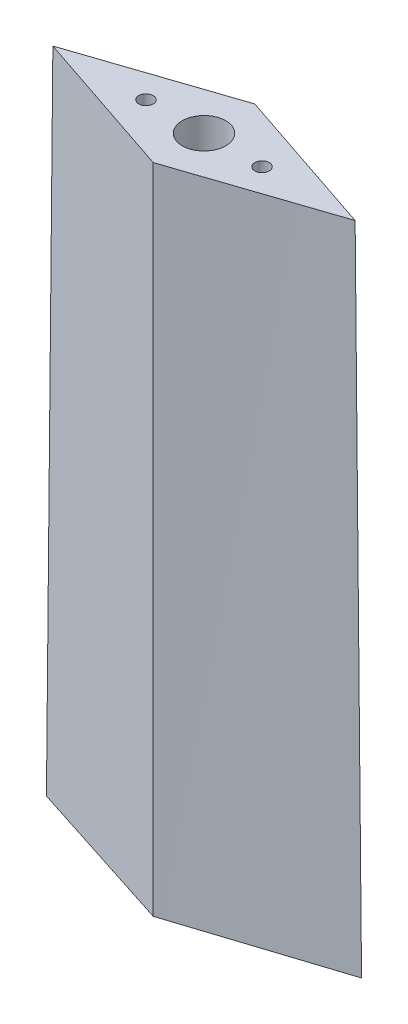
ISO-10303-21;
HEADER;
FILE_DESCRIPTION(('STEP AP214'),'2;1');
FILE_NAME('part.step','',(''),(''),'','','');
FILE_SCHEMA(('AUTOMOTIVE_DESIGN { 1 0 10303 214 1 1 1 1 }'));
ENDSEC;
DATA;
#1=APPLICATION_CONTEXT('core data for automotive mechanical design processes');
#2=APPLICATION_PROTOCOL_DEFINITION('international standard','automotive_design',2000,#1);
#3=PRODUCT_CONTEXT('',#1,'mechanical');
#4=PRODUCT('Part','Part','',(#3));
#5=PRODUCT_RELATED_PRODUCT_CATEGORY('part','',(#4));
#6=PRODUCT_DEFINITION_FORMATION('','',#4);
#7=PRODUCT_DEFINITION_CONTEXT('part definition',#1,'design');
#8=PRODUCT_DEFINITION('design','',#6,#7);
#9=PRODUCT_DEFINITION_SHAPE('','',#8);
#10=(LENGTH_UNIT() NAMED_UNIT(*) SI_UNIT(.MILLI.,.METRE.));
#11=(NAMED_UNIT(*) PLANE_ANGLE_UNIT() SI_UNIT($,.RADIAN.));
#12=(NAMED_UNIT(*) SI_UNIT($,.STERADIAN.) SOLID_ANGLE_UNIT());
#13=UNCERTAINTY_MEASURE_WITH_UNIT(LENGTH_MEASURE(1.E-05),#10,'distance_accuracy_value','');
#14=(GEOMETRIC_REPRESENTATION_CONTEXT(3) GLOBAL_UNCERTAINTY_ASSIGNED_CONTEXT((#13)) GLOBAL_UNIT_ASSIGNED_CONTEXT((#10,
#11,#12)) REPRESENTATION_CONTEXT('',''));
#15=CARTESIAN_POINT('',(0.,0.,0.));
#16=DIRECTION('',(0.,0.,1.));
#17=DIRECTION('',(1.,0.,0.));
#18=AXIS2_PLACEMENT_3D('',#15,#16,#17);
#19=CARTESIAN_POINT('',(219.716026671538,465.168027231046,0.));
#20=CARTESIAN_POINT('',(213.502471629307,1096.96763455169,0.));
#21=CARTESIAN_POINT('',(213.274793673085,465.168027231046,1.85208333333331));
#22=CARTESIAN_POINT('',(208.096831137892,1096.96763455169,1.85208333333331));
#23=CARTESIAN_POINT('',(206.833560674631,465.168027231046,3.70416666666664));
#24=CARTESIAN_POINT('',(202.691190646477,1096.96763455169,3.70416666666663));
#25=CARTESIAN_POINT('',(193.951094677724,465.168027231046,7.4083333333333));
#26=CARTESIAN_POINT('',(191.879909663647,1096.96763455169,7.4083333333333));
#27=CARTESIAN_POINT('',(187.509861679271,465.168027231046,9.26041666666665));
#28=CARTESIAN_POINT('',(186.474269172232,1096.96763455169,9.26041666666665));
#29=CARTESIAN_POINT('',(181.068628680817,465.168027231046,11.1125));
#30=CARTESIAN_POINT('',(181.068628680817,1096.96763455169,11.1125));
#31=B_SPLINE_SURFACE_WITH_KNOTS('',3,1,((#19,#20),(#21,#22),(#23,#24),(#25,#26),(#27,#28),(#29,
#30)),.UNSPECIFIED.,.F.,.F.,.F.,(4,2,4),(2,2),(0.,0.5,1.),(0.,1.),.UNSPECIFIED.);
#32=CARTESIAN_POINT('',(215.551829032432,888.587215652406,0.));
#33=CARTESIAN_POINT('',(212.362250617464,888.587215652406,1.02786834675771));
#34=CARTESIAN_POINT('',(209.172672202496,888.587215652406,2.05573669351542));
#35=CARTESIAN_POINT('',(202.793515372561,888.587215652406,4.11147338703085));
#36=CARTESIAN_POINT('',(199.603936957593,888.587215652406,5.13934173378856));
#37=CARTESIAN_POINT('',(191.299115255356,888.587215652406,7.81564005369751));
#38=CARTESIAN_POINT('',(186.183871968087,888.587215652406,9.46407002684876));
#39=CARTESIAN_POINT('',(181.068628680817,888.587215652406,11.1125));
#40=B_SPLINE_CURVE_WITH_KNOTS('',3,(#32,#33,#34,#35,#36,#37,#38,#39),.UNSPECIFIED.,.F.,.F.,(4,2,
2,4),(0.,10.0533235415682,20.1066470831363,36.2295288782446),.UNSPECIFIED.);
#41=CARTESIAN_POINT('',(215.551829032432,888.587215652406,0.));
#42=VERTEX_POINT('',#41);
#43=CARTESIAN_POINT('',(181.068628680817,888.587215652406,11.1125));
#44=VERTEX_POINT('',#43);
#45=EDGE_CURVE('E142',#42,#44,#40,.T.);
#46=DIRECTION('',(-0.00983421721197636,0.99995164291671,0.));
#47=VECTOR('',#46,1.);
#48=CARTESIAN_POINT('',(219.716026671538,465.168027231046,0.));
#49=LINE('',#48,#47);
#50=CARTESIAN_POINT('',(214.146697300198,1031.46221565241,0.));
#51=VERTEX_POINT('',#50);
#52=EDGE_CURVE('E12',#42,#51,#49,.T.);
#53=CARTESIAN_POINT('',(181.068628680817,1031.46221565241,11.1125));
#54=CARTESIAN_POINT('',(184.245268499691,1031.46221565241,10.0453152621779));
#55=CARTESIAN_POINT('',(187.421908318565,1031.46221565241,8.97813052435588));
#56=CARTESIAN_POINT('',(193.775187956312,1031.46221565241,6.84376104871176));
#57=CARTESIAN_POINT('',(196.951827775186,1031.46221565241,5.7765763108897));
#58=CARTESIAN_POINT('',(204.801210829439,1031.46221565241,3.13959438204509));
#59=CARTESIAN_POINT('',(209.473954064819,1031.46221565241,1.56979719102255));
#60=CARTESIAN_POINT('',(214.146697300198,1031.46221565241,0.));
#61=B_SPLINE_CURVE_WITH_KNOTS('',3,(#53,#54,#55,#56,#57,#58,#59,#60),.UNSPECIFIED.,.F.,.F.,(4,2,
2,4),(0.,10.0533235415682,20.1066470831363,34.8947887203586),.UNSPECIFIED.);
#62=CARTESIAN_POINT('',(181.068628680817,1031.46221565241,11.1125));
#63=VERTEX_POINT('',#62);
#64=EDGE_CURVE('E120',#63,#51,#61,.T.);
#65=DIRECTION('',(0.,1.,0.));
#66=VECTOR('',#65,1.);
#67=CARTESIAN_POINT('',(181.068628680817,781.067830891368,11.1125));
#68=LINE('',#67,#66);
#69=EDGE_CURVE('E68',#44,#63,#68,.T.);
#70=ORIENTED_EDGE('',*,*,#45,.F.);
#71=ORIENTED_EDGE('',*,*,#52,.T.);
#72=ORIENTED_EDGE('',*,*,#64,.F.);
#73=ORIENTED_EDGE('',*,*,#69,.F.);
#74=EDGE_LOOP('',(#70,#71,#72,#73));
#75=FACE_BOUND('',#74,.T.);
#76=ADVANCED_FACE('F61',(#75),#31,.F.);
#77=CARTESIAN_POINT('',(181.068628680817,465.168027231046,11.1125));
#78=CARTESIAN_POINT('',(181.068628680817,1096.96763455169,11.1125));
#79=CARTESIAN_POINT('',(174.627395682364,465.168027231046,9.26041666666668));
#80=CARTESIAN_POINT('',(175.662988189402,1096.96763455169,9.26041666666663));
#81=CARTESIAN_POINT('',(168.186162683911,465.168027231046,7.40833333333335));
#82=CARTESIAN_POINT('',(170.257347697988,1096.96763455169,7.40833333333328));
#83=CARTESIAN_POINT('',(155.303696687004,465.168027231046,3.70416666666668));
#84=CARTESIAN_POINT('',(159.446066715158,1096.96763455169,3.70416666666661));
#85=CARTESIAN_POINT('',(148.86246368855,465.168027231046,1.85208333333334));
#86=CARTESIAN_POINT('',(154.040426223743,1096.96763455169,1.8520833333333));
#87=CARTESIAN_POINT('',(142.421230690097,465.168027231046,0.));
#88=CARTESIAN_POINT('',(148.634785732328,1096.96763455169,0.));
#89=B_SPLINE_SURFACE_WITH_KNOTS('',3,1,((#77,#78),(#79,#80),(#81,#82),(#83,#84),(#85,#86),(#87,
#88)),.UNSPECIFIED.,.F.,.F.,.F.,(4,2,4),(2,2),(0.,0.5,1.),(0.,1.),.UNSPECIFIED.);
#90=CARTESIAN_POINT('',(181.068628680817,888.587215652406,11.1125));
#91=CARTESIAN_POINT('',(177.87905026585,888.587215652406,10.0846316532423));
#92=CARTESIAN_POINT('',(174.689471850882,888.587215652406,9.05676330648458));
#93=CARTESIAN_POINT('',(168.310315020947,888.587215652406,7.00102661296915));
#94=CARTESIAN_POINT('',(165.120736605979,888.587215652406,5.97315826621144));
#95=CARTESIAN_POINT('',(156.815914903742,888.587215652406,3.29685994630247));
#96=CARTESIAN_POINT('',(151.700671616473,888.587215652406,1.64842997315123));
#97=CARTESIAN_POINT('',(146.585428329203,888.587215652406,0.));
#98=B_SPLINE_CURVE_WITH_KNOTS('',3,(#90,#91,#92,#93,#94,#95,#96,#97),.UNSPECIFIED.,.F.,.F.,(4,2,
2,4),(0.,10.0533235415682,20.1066470831363,36.2295288782446),.UNSPECIFIED.);
#99=CARTESIAN_POINT('',(146.585428329203,888.587215652406,0.));
#100=VERTEX_POINT('',#99);
#101=EDGE_CURVE('E80',#44,#100,#98,.T.);
#102=CARTESIAN_POINT('',(147.990560061437,1031.46221565241,0.));
#103=CARTESIAN_POINT('',(151.16719988031,1031.46221565241,1.06718473782206));
#104=CARTESIAN_POINT('',(154.343839699184,1031.46221565241,2.13436947564412));
#105=CARTESIAN_POINT('',(160.697119336932,1031.46221565241,4.26873895128824));
#106=CARTESIAN_POINT('',(163.873759155805,1031.46221565241,5.3359236891103));
#107=CARTESIAN_POINT('',(171.723142210058,1031.46221565241,7.9729056179549));
#108=CARTESIAN_POINT('',(176.395885445438,1031.46221565241,9.54270280897745));
#109=CARTESIAN_POINT('',(181.068628680817,1031.46221565241,11.1125));
#110=B_SPLINE_CURVE_WITH_KNOTS('',3,(#102,#103,#104,#105,#106,#107,#108,#109),.UNSPECIFIED.,.F.,
.F.,(4,2,2,4),(0.,10.0533235415682,20.1066470831363,34.8947887203586),.UNSPECIFIED.);
#111=CARTESIAN_POINT('',(147.990560061437,1031.46221565241,0.));
#112=VERTEX_POINT('',#111);
#113=EDGE_CURVE('E124',#112,#63,#110,.T.);
#114=DIRECTION('',(0.00983421721197636,0.99995164291671,0.));
#115=VECTOR('',#114,1.);
#116=CARTESIAN_POINT('',(145.528008211213,781.067830891368,0.));
#117=LINE('',#116,#115);
#118=EDGE_CURVE('E119',#100,#112,#117,.T.);
#119=ORIENTED_EDGE('',*,*,#101,.F.);
#120=ORIENTED_EDGE('',*,*,#69,.T.);
#121=ORIENTED_EDGE('',*,*,#113,.F.);
#122=ORIENTED_EDGE('',*,*,#118,.F.);
#123=EDGE_LOOP('',(#119,#120,#121,#122));
#124=FACE_BOUND('',#123,.T.);
#125=ADVANCED_FACE('F63',(#124),#89,.F.);
#126=CARTESIAN_POINT('',(219.716026671538,465.168027231046,0.));
#127=CARTESIAN_POINT('',(213.502471629307,1096.96763455169,0.));
#128=CARTESIAN_POINT('',(213.274793673085,465.168027231046,-1.85208333333331));
#129=CARTESIAN_POINT('',(208.096831137892,1096.96763455169,-1.85208333333331));
#130=CARTESIAN_POINT('',(206.833560674631,465.168027231046,-3.70416666666664));
#131=CARTESIAN_POINT('',(202.691190646477,1096.96763455169,-3.70416666666663));
#132=CARTESIAN_POINT('',(193.951094677724,465.168027231046,-7.4083333333333));
#133=CARTESIAN_POINT('',(191.879909663647,1096.96763455169,-7.4083333333333));
#134=CARTESIAN_POINT('',(187.509861679271,465.168027231046,-9.26041666666665));
#135=CARTESIAN_POINT('',(186.474269172232,1096.96763455169,-9.26041666666665));
#136=CARTESIAN_POINT('',(181.068628680817,465.168027231046,-11.1125));
#137=CARTESIAN_POINT('',(181.068628680817,1096.96763455169,-11.1125));
#138=B_SPLINE_SURFACE_WITH_KNOTS('',3,1,((#126,#127),(#128,#129),(#130,#131),(#132,#133),(#134,
#135),(#136,#137)),.UNSPECIFIED.,.F.,.F.,.F.,(4,2,4),(2,2),(0.,0.5,1.),(0.,1.),.UNSPECIFIED.);
#139=CARTESIAN_POINT('',(181.068628680817,888.587215652406,-11.1125));
#140=CARTESIAN_POINT('',(184.258207095785,888.587215652406,-10.0846316532423));
#141=CARTESIAN_POINT('',(187.447785510753,888.587215652406,-9.05676330648458));
#142=CARTESIAN_POINT('',(193.826942340688,888.587215652406,-7.00102661296915));
#143=CARTESIAN_POINT('',(197.016520755656,888.587215652406,-5.97315826621143));
#144=CARTESIAN_POINT('',(205.321342457893,888.587215652406,-3.29685994630248));
#145=CARTESIAN_POINT('',(210.436585745162,888.587215652406,-1.64842997315124));
#146=CARTESIAN_POINT('',(215.551829032432,888.587215652406,0.));
#147=B_SPLINE_CURVE_WITH_KNOTS('',3,(#139,#140,#141,#142,#143,#144,#145,#146),.UNSPECIFIED.,.F.,
.F.,(4,2,2,4),(0.,10.0533235415682,20.1066470831364,36.2295288782446),.UNSPECIFIED.);
#148=CARTESIAN_POINT('',(181.068628680817,888.587215652406,-11.1125));
#149=VERTEX_POINT('',#148);
#150=EDGE_CURVE('E106',#149,#42,#147,.T.);
#151=DIRECTION('',(0.,1.,0.));
#152=VECTOR('',#151,1.);
#153=CARTESIAN_POINT('',(181.068628680817,781.067830891368,-11.1125));
#154=LINE('',#153,#152);
#155=CARTESIAN_POINT('',(181.068628680817,1031.46221565241,-11.1125));
#156=VERTEX_POINT('',#155);
#157=EDGE_CURVE('E88',#149,#156,#154,.T.);
#158=CARTESIAN_POINT('',(214.146697300198,1031.46221565241,0.));
#159=CARTESIAN_POINT('',(210.970057481325,1031.46221565241,-1.06718473782206));
#160=CARTESIAN_POINT('',(207.793417662451,1031.46221565241,-2.13436947564412));
#161=CARTESIAN_POINT('',(201.440138024703,1031.46221565241,-4.26873895128824));
#162=CARTESIAN_POINT('',(198.26349820583,1031.46221565241,-5.3359236891103));
#163=CARTESIAN_POINT('',(190.414115151577,1031.46221565241,-7.9729056179549));
#164=CARTESIAN_POINT('',(185.741371916197,1031.46221565241,-9.54270280897745));
#165=CARTESIAN_POINT('',(181.068628680817,1031.46221565241,-11.1125));
#166=B_SPLINE_CURVE_WITH_KNOTS('',3,(#158,#159,#160,#161,#162,#163,#164,#165),.UNSPECIFIED.,.F.,
.F.,(4,2,2,4),(0.,10.0533235415682,20.1066470831363,34.8947887203586),.UNSPECIFIED.);
#167=EDGE_CURVE('E145',#51,#156,#166,.T.);
#168=ORIENTED_EDGE('',*,*,#150,.F.);
#169=ORIENTED_EDGE('',*,*,#157,.T.);
#170=ORIENTED_EDGE('',*,*,#167,.F.);
#171=ORIENTED_EDGE('',*,*,#52,.F.);
#172=EDGE_LOOP('',(#168,#169,#170,#171));
#173=FACE_BOUND('',#172,.T.);
#174=ADVANCED_FACE('F113',(#173),#138,.T.);
#175=CARTESIAN_POINT('',(181.068628680817,465.168027231046,-11.1125));
#176=CARTESIAN_POINT('',(181.068628680817,1096.96763455169,-11.1125));
#177=CARTESIAN_POINT('',(174.627395682364,465.168027231046,-9.26041666666668));
#178=CARTESIAN_POINT('',(175.662988189402,1096.96763455169,-9.26041666666663));
#179=CARTESIAN_POINT('',(168.186162683911,465.168027231046,-7.40833333333335));
#180=CARTESIAN_POINT('',(170.257347697988,1096.96763455169,-7.40833333333328));
#181=CARTESIAN_POINT('',(155.303696687004,465.168027231046,-3.70416666666668));
#182=CARTESIAN_POINT('',(159.446066715158,1096.96763455169,-3.70416666666661));
#183=CARTESIAN_POINT('',(148.86246368855,465.168027231046,-1.85208333333334));
#184=CARTESIAN_POINT('',(154.040426223743,1096.96763455169,-1.8520833333333));
#185=CARTESIAN_POINT('',(142.421230690097,465.168027231046,0.));
#186=CARTESIAN_POINT('',(148.634785732328,1096.96763455169,0.));
#187=B_SPLINE_SURFACE_WITH_KNOTS('',3,1,((#175,#176),(#177,#178),(#179,#180),(#181,#182),(#183,
#184),(#185,#186)),.UNSPECIFIED.,.F.,.F.,.F.,(4,2,4),(2,2),(0.,0.5,1.),(0.,1.),.UNSPECIFIED.);
#188=CARTESIAN_POINT('',(146.585428329203,888.587215652406,0.));
#189=CARTESIAN_POINT('',(149.775006744171,888.587215652406,-1.0278683467577));
#190=CARTESIAN_POINT('',(152.964585159139,888.587215652406,-2.05573669351541));
#191=CARTESIAN_POINT('',(159.343741989074,888.587215652406,-4.11147338703084));
#192=CARTESIAN_POINT('',(162.533320404042,888.587215652406,-5.13934173378856));
#193=CARTESIAN_POINT('',(170.838142106279,888.587215652406,-7.81564005369752));
#194=CARTESIAN_POINT('',(175.953385393548,888.587215652406,-9.46407002684877));
#195=CARTESIAN_POINT('',(181.068628680817,888.587215652406,-11.1125));
#196=B_SPLINE_CURVE_WITH_KNOTS('',3,(#188,#189,#190,#191,#192,#193,#194,#195),.UNSPECIFIED.,.F.,
.F.,(4,2,2,4),(0.,10.0533235415682,20.1066470831363,36.2295288782446),.UNSPECIFIED.);
#197=EDGE_CURVE('E104',#100,#149,#196,.T.);
#198=CARTESIAN_POINT('',(181.068628680817,1031.46221565241,-11.1125));
#199=CARTESIAN_POINT('',(177.891988861944,1031.46221565241,-10.0453152621779));
#200=CARTESIAN_POINT('',(174.71534904307,1031.46221565241,-8.97813052435588));
#201=CARTESIAN_POINT('',(168.362069405323,1031.46221565241,-6.84376104871176));
#202=CARTESIAN_POINT('',(165.185429586449,1031.46221565241,-5.7765763108897));
#203=CARTESIAN_POINT('',(157.336046532196,1031.46221565241,-3.13959438204508));
#204=CARTESIAN_POINT('',(152.663303296816,1031.46221565241,-1.56979719102253));
#205=CARTESIAN_POINT('',(147.990560061437,1031.46221565241,0.));
#206=B_SPLINE_CURVE_WITH_KNOTS('',3,(#198,#199,#200,#201,#202,#203,#204,#205),.UNSPECIFIED.,.F.,
.F.,(4,2,2,4),(0.,10.0533235415682,20.1066470831363,34.8947887203586),.UNSPECIFIED.);
#207=EDGE_CURVE('E118',#156,#112,#206,.T.);
#208=ORIENTED_EDGE('',*,*,#197,.F.);
#209=ORIENTED_EDGE('',*,*,#118,.T.);
#210=ORIENTED_EDGE('',*,*,#207,.F.);
#211=ORIENTED_EDGE('',*,*,#157,.F.);
#212=EDGE_LOOP('',(#208,#209,#210,#211));
#213=FACE_BOUND('',#212,.T.);
#214=ADVANCED_FACE('F116',(#213),#187,.T.);
#215=CARTESIAN_POINT('',(181.068628680817,1100.16802723105,0.));
#216=DIRECTION('',(0.,-1.,0.));
#217=DIRECTION('',(0.,0.,-1.));
#218=AXIS2_PLACEMENT_3D('',#215,#216,#217);
#219=CYLINDRICAL_SURFACE('',#218,4.76250000000001);
#220=CARTESIAN_POINT('',(181.068628680817,1031.46221565241,0.));
#221=DIRECTION('',(0.,1.,0.));
#222=DIRECTION('',(0.,0.,1.));
#223=AXIS2_PLACEMENT_3D('',#220,#221,#222);
#224=CIRCLE('',#223,4.76250000000001);
#225=CARTESIAN_POINT('',(181.068628680817,1031.46221565241,-4.76250000000001));
#226=VERTEX_POINT('',#225);
#227=EDGE_CURVE('E140',#226,#226,#224,.F.);
#228=CARTESIAN_POINT('',(181.068628680817,888.587215652406,0.));
#229=DIRECTION('',(0.,-1.,0.));
#230=DIRECTION('',(0.,0.,-1.));
#231=AXIS2_PLACEMENT_3D('',#228,#229,#230);
#232=CIRCLE('',#231,4.76250000000001);
#233=CARTESIAN_POINT('',(181.068628680817,888.587215652406,-4.76250000000001));
#234=VERTEX_POINT('',#233);
#235=EDGE_CURVE('E110',#234,#234,#232,.F.);
#236=CARTESIAN_POINT('',(181.068628680817,1031.46221565241,-4.76250000000001));
#237=CARTESIAN_POINT('',(181.068628680817,1029.97393440241,-4.76250000000001));
#238=CARTESIAN_POINT('',(181.068628680817,1028.48565315241,-4.76250000000001));
#239=CARTESIAN_POINT('',(181.068628680817,1025.50909065241,-4.76250000000001));
#240=CARTESIAN_POINT('',(181.068628680817,1024.02080940241,-4.76250000000001));
#241=CARTESIAN_POINT('',(181.068628680817,1021.04424690241,-4.76250000000001));
#242=CARTESIAN_POINT('',(181.068628680817,1019.55596565241,-4.76250000000001));
#243=CARTESIAN_POINT('',(181.068628680817,1016.57940315241,-4.76250000000001));
#244=CARTESIAN_POINT('',(181.068628680817,1015.09112190241,-4.76250000000001));
#245=CARTESIAN_POINT('',(181.068628680817,1012.11455940241,-4.76250000000001));
#246=CARTESIAN_POINT('',(181.068628680817,1010.62627815241,-4.76250000000001));
#247=CARTESIAN_POINT('',(181.068628680817,1007.64971565241,-4.76250000000001));
#248=CARTESIAN_POINT('',(181.068628680817,1006.16143440241,-4.76250000000001));
#249=CARTESIAN_POINT('',(181.068628680817,1003.18487190241,-4.76250000000001));
#250=CARTESIAN_POINT('',(181.068628680817,1001.69659065241,-4.76250000000001));
#251=CARTESIAN_POINT('',(181.068628680817,998.720028152406,-4.76250000000001));
#252=CARTESIAN_POINT('',(181.068628680817,997.231746902406,-4.76250000000001));
#253=CARTESIAN_POINT('',(181.068628680817,994.255184402406,-4.76250000000001));
#254=CARTESIAN_POINT('',(181.068628680817,992.766903152406,-4.76250000000001));
#255=CARTESIAN_POINT('',(181.068628680817,989.790340652406,-4.76250000000001));
#256=CARTESIAN_POINT('',(181.068628680817,988.302059402406,-4.76250000000001));
#257=CARTESIAN_POINT('',(181.068628680817,985.325496902406,-4.76250000000001));
#258=CARTESIAN_POINT('',(181.068628680817,983.837215652406,-4.76250000000001));
#259=CARTESIAN_POINT('',(181.068628680817,980.860653152406,-4.76250000000001));
#260=CARTESIAN_POINT('',(181.068628680817,979.372371902406,-4.76250000000001));
#261=CARTESIAN_POINT('',(181.068628680817,976.395809402406,-4.76250000000001));
#262=CARTESIAN_POINT('',(181.068628680817,974.907528152406,-4.76250000000001));
#263=CARTESIAN_POINT('',(181.068628680817,971.930965652406,-4.76250000000001));
#264=CARTESIAN_POINT('',(181.068628680817,970.442684402406,-4.76250000000001));
#265=CARTESIAN_POINT('',(181.068628680817,967.466121902406,-4.76250000000001));
#266=CARTESIAN_POINT('',(181.068628680817,965.977840652406,-4.76250000000001));
#267=CARTESIAN_POINT('',(181.068628680817,963.001278152406,-4.76250000000001));
#268=CARTESIAN_POINT('',(181.068628680817,961.512996902406,-4.76250000000001));
#269=CARTESIAN_POINT('',(181.068628680817,958.536434402406,-4.76250000000001));
#270=CARTESIAN_POINT('',(181.068628680817,957.048153152406,-4.76250000000001));
#271=CARTESIAN_POINT('',(181.068628680817,954.071590652406,-4.76250000000001));
#272=CARTESIAN_POINT('',(181.068628680817,952.583309402406,-4.76250000000001));
#273=CARTESIAN_POINT('',(181.068628680817,949.606746902406,-4.76250000000001));
#274=CARTESIAN_POINT('',(181.068628680817,948.118465652406,-4.76250000000001));
#275=CARTESIAN_POINT('',(181.068628680817,945.141903152406,-4.76250000000001));
#276=CARTESIAN_POINT('',(181.068628680817,943.653621902406,-4.76250000000001));
#277=CARTESIAN_POINT('',(181.068628680817,940.677059402406,-4.76250000000001));
#278=CARTESIAN_POINT('',(181.068628680817,939.188778152406,-4.76250000000001));
#279=CARTESIAN_POINT('',(181.068628680817,936.212215652406,-4.76250000000001));
#280=CARTESIAN_POINT('',(181.068628680817,934.723934402406,-4.76250000000001));
#281=CARTESIAN_POINT('',(181.068628680817,931.747371902406,-4.76250000000001));
#282=CARTESIAN_POINT('',(181.068628680817,930.259090652406,-4.76250000000001));
#283=CARTESIAN_POINT('',(181.068628680817,927.282528152406,-4.76250000000001));
#284=CARTESIAN_POINT('',(181.068628680817,925.794246902406,-4.76250000000001));
#285=CARTESIAN_POINT('',(181.068628680817,922.817684402406,-4.76250000000001));
#286=CARTESIAN_POINT('',(181.068628680817,921.329403152406,-4.76250000000001));
#287=CARTESIAN_POINT('',(181.068628680817,918.352840652406,-4.76250000000001));
#288=CARTESIAN_POINT('',(181.068628680817,916.864559402406,-4.76250000000001));
#289=CARTESIAN_POINT('',(181.068628680817,913.887996902406,-4.76250000000001));
#290=CARTESIAN_POINT('',(181.068628680817,912.399715652406,-4.76250000000001));
#291=CARTESIAN_POINT('',(181.068628680817,909.423153152406,-4.76250000000001));
#292=CARTESIAN_POINT('',(181.068628680817,907.934871902406,-4.76250000000001));
#293=CARTESIAN_POINT('',(181.068628680817,904.958309402406,-4.76250000000001));
#294=CARTESIAN_POINT('',(181.068628680817,903.470028152406,-4.76250000000001));
#295=CARTESIAN_POINT('',(181.068628680817,900.493465652406,-4.76250000000001));
#296=CARTESIAN_POINT('',(181.068628680817,899.005184402406,-4.76250000000001));
#297=CARTESIAN_POINT('',(181.068628680817,896.028621902406,-4.76250000000001));
#298=CARTESIAN_POINT('',(181.068628680817,894.540340652406,-4.76250000000001));
#299=CARTESIAN_POINT('',(181.068628680817,891.563778152406,-4.76250000000001));
#300=CARTESIAN_POINT('',(181.068628680817,890.075496902406,-4.76250000000001));
#301=CARTESIAN_POINT('',(181.068628680817,888.587215652406,-4.76250000000001));
#302=B_SPLINE_CURVE_WITH_KNOTS('',3,(#236,#237,#238,#239,#240,#241,#242,#243,#244,#245,#246,
#247,#248,#249,#250,#251,#252,#253,#254,#255,#256,#257,#258,#259,#260,#261,#262,#263,#264,#265,
#266,#267,#268,#269,#270,#271,#272,#273,#274,#275,#276,#277,#278,#279,#280,#281,#282,#283,#284,
#285,#286,#287,#288,#289,#290,#291,#292,#293,#294,#295,#296,#297,#298,#299,#300,#301),
.UNSPECIFIED.,.F.,.F.,(4,2,2,2,2,2,2,2,2,2,2,2,2,2,2,2,2,2,2,2,2,2,2,2,2,2,2,2,2,2,2,2,4),(0.,
4.46484374999989,8.92968750000001,13.3945312499999,17.8593749999998,22.3242187499999,
26.7890624999998,31.2539062499999,35.7187499999999,40.1835937499999,44.6484374999998,
49.1132812499998,53.5781249999998,58.0429687499998,62.5078124999998,66.9726562499998,
71.4374999999998,75.9023437499998,80.3671874999998,84.8320312499998,89.2968749999998,
93.7617187499997,98.2265624999998,102.69140625,107.15625,111.62109375,116.0859375,120.55078125,
125.015625,129.48046875,133.9453125,138.41015625,142.875),.UNSPECIFIED.);
#303=EDGE_CURVE('BSEAM188',#226,#234,#302,.T.);
#304=ORIENTED_EDGE('',*,*,#227,.F.);
#305=ORIENTED_EDGE('',*,*,#235,.F.);
#306=ORIENTED_EDGE('',*,*,#303,.T.);
#307=ORIENTED_EDGE('',*,*,#303,.F.);
#308=EDGE_LOOP('',(#304,#306,#305,#307));
#309=FACE_BOUND('',#308,.T.);
#310=ADVANCED_FACE('F188',(#309),#219,.F.);
#311=CARTESIAN_POINT('',(0.,1031.46221565241,-11.1126));
#312=DIRECTION('',(0.,1.,0.));
#313=DIRECTION('',(0.,0.,1.));
#314=AXIS2_PLACEMENT_3D('',#311,#312,#313);
#315=PLANE('',#314);
#316=CARTESIAN_POINT('',(193.768628680817,1031.46221565241,0.));
#317=DIRECTION('',(0.,1.,0.));
#318=DIRECTION('',(0.,0.,1.));
#319=AXIS2_PLACEMENT_3D('',#316,#317,#318);
#320=CIRCLE('',#319,1.58749999999999);
#321=CARTESIAN_POINT('',(193.768628680817,1031.46221565241,1.58749999999999));
#322=VERTEX_POINT('',#321);
#323=EDGE_CURVE('E341',#322,#322,#320,.T.);
#324=ORIENTED_EDGE('',*,*,#323,.F.);
#325=EDGE_LOOP('',(#324));
#326=FACE_BOUND('',#325,.T.);
#327=CARTESIAN_POINT('',(168.368628680817,1031.46221565241,0.));
#328=DIRECTION('',(0.,1.,0.));
#329=DIRECTION('',(0.,0.,1.));
#330=AXIS2_PLACEMENT_3D('',#327,#328,#329);
#331=CIRCLE('',#330,1.58749999999999);
#332=CARTESIAN_POINT('',(168.368628680817,1031.46221565241,1.58749999999999));
#333=VERTEX_POINT('',#332);
#334=EDGE_CURVE('E340',#333,#333,#331,.T.);
#335=ORIENTED_EDGE('',*,*,#334,.F.);
#336=EDGE_LOOP('',(#335));
#337=FACE_BOUND('',#336,.T.);
#338=ORIENTED_EDGE('',*,*,#227,.T.);
#339=EDGE_LOOP('',(#338));
#340=FACE_BOUND('',#339,.T.);
#341=ORIENTED_EDGE('',*,*,#64,.T.);
#342=ORIENTED_EDGE('',*,*,#167,.T.);
#343=ORIENTED_EDGE('',*,*,#207,.T.);
#344=ORIENTED_EDGE('',*,*,#113,.T.);
#345=EDGE_LOOP('',(#341,#342,#343,#344));
#346=FACE_BOUND('',#345,.T.);
#347=ADVANCED_FACE('F168',(#326,#337,#340,#346),#315,.T.);
#348=CARTESIAN_POINT('',(0.,888.587215652406,-11.1126));
#349=DIRECTION('',(0.,-1.,0.));
#350=DIRECTION('',(0.,0.,-1.));
#351=AXIS2_PLACEMENT_3D('',#348,#349,#350);
#352=PLANE('',#351);
#353=CARTESIAN_POINT('',(193.768628680817,888.587215652406,0.));
#354=DIRECTION('',(0.,-1.,0.));
#355=DIRECTION('',(0.,0.,-1.));
#356=AXIS2_PLACEMENT_3D('',#353,#354,#355);
#357=CIRCLE('',#356,1.58749999999999);
#358=CARTESIAN_POINT('',(193.768628680817,888.587215652406,-1.58749999999999));
#359=VERTEX_POINT('',#358);
#360=EDGE_CURVE('E350',#359,#359,#357,.T.);
#361=ORIENTED_EDGE('',*,*,#360,.F.);
#362=EDGE_LOOP('',(#361));
#363=FACE_BOUND('',#362,.T.);
#364=CARTESIAN_POINT('',(168.368628680817,888.587215652406,0.));
#365=DIRECTION('',(0.,-1.,0.));
#366=DIRECTION('',(0.,0.,-1.));
#367=AXIS2_PLACEMENT_3D('',#364,#365,#366);
#368=CIRCLE('',#367,1.58749999999999);
#369=CARTESIAN_POINT('',(168.368628680817,888.587215652406,-1.58749999999999));
#370=VERTEX_POINT('',#369);
#371=EDGE_CURVE('E355',#370,#370,#368,.T.);
#372=ORIENTED_EDGE('',*,*,#371,.F.);
#373=EDGE_LOOP('',(#372));
#374=FACE_BOUND('',#373,.T.);
#375=ORIENTED_EDGE('',*,*,#235,.T.);
#376=EDGE_LOOP('',(#375));
#377=FACE_BOUND('',#376,.T.);
#378=ORIENTED_EDGE('',*,*,#45,.T.);
#379=ORIENTED_EDGE('',*,*,#101,.T.);
#380=ORIENTED_EDGE('',*,*,#197,.T.);
#381=ORIENTED_EDGE('',*,*,#150,.T.);
#382=EDGE_LOOP('',(#378,#379,#380,#381));
#383=FACE_BOUND('',#382,.T.);
#384=ADVANCED_FACE('F105',(#363,#374,#377,#383),#352,.T.);
#385=CARTESIAN_POINT('',(168.368628680817,901.287215652406,0.));
#386=DIRECTION('',(0.,-1.,0.));
#387=DIRECTION('',(0.,0.,-1.));
#388=AXIS2_PLACEMENT_3D('',#385,#386,#387);
#389=CYLINDRICAL_SURFACE('',#388,1.58749999999999);
#390=CARTESIAN_POINT('',(168.368628680817,901.287215652406,0.));
#391=DIRECTION('',(0.,-1.,0.));
#392=DIRECTION('',(0.,0.,-1.));
#393=AXIS2_PLACEMENT_3D('',#390,#391,#392);
#394=CIRCLE('',#393,1.58749999999999);
#395=CARTESIAN_POINT('',(168.368628680817,901.287215652406,-1.58749999999999));
#396=VERTEX_POINT('',#395);
#397=EDGE_CURVE('E358',#396,#396,#394,.T.);
#398=ORIENTED_EDGE('',*,*,#397,.F.);
#399=EDGE_LOOP('',(#398));
#400=FACE_BOUND('',#399,.T.);
#401=ORIENTED_EDGE('',*,*,#371,.T.);
#402=EDGE_LOOP('',(#401));
#403=FACE_BOUND('',#402,.T.);
#404=ADVANCED_FACE('F167',(#400,#403),#389,.F.);
#405=CARTESIAN_POINT('',(168.368628680817,901.287215652406,0.));
#406=DIRECTION('',(0.,-1.,0.));
#407=DIRECTION('',(0.,0.,-1.));
#408=AXIS2_PLACEMENT_3D('',#405,#406,#407);
#409=PLANE('',#408);
#410=ORIENTED_EDGE('',*,*,#397,.T.);
#411=EDGE_LOOP('',(#410));
#412=FACE_BOUND('',#411,.T.);
#413=ADVANCED_FACE('F259',(#412),#409,.T.);
#414=CARTESIAN_POINT('',(193.768628680817,901.287215652406,0.));
#415=DIRECTION('',(0.,-1.,0.));
#416=DIRECTION('',(0.,0.,-1.));
#417=AXIS2_PLACEMENT_3D('',#414,#415,#416);
#418=CYLINDRICAL_SURFACE('',#417,1.58749999999999);
#419=CARTESIAN_POINT('',(193.768628680817,901.287215652406,0.));
#420=DIRECTION('',(0.,-1.,0.));
#421=DIRECTION('',(0.,0.,-1.));
#422=AXIS2_PLACEMENT_3D('',#419,#420,#421);
#423=CIRCLE('',#422,1.58749999999999);
#424=CARTESIAN_POINT('',(193.768628680817,901.287215652406,-1.58749999999999));
#425=VERTEX_POINT('',#424);
#426=EDGE_CURVE('E352',#425,#425,#423,.T.);
#427=ORIENTED_EDGE('',*,*,#426,.F.);
#428=EDGE_LOOP('',(#427));
#429=FACE_BOUND('',#428,.T.);
#430=ORIENTED_EDGE('',*,*,#360,.T.);
#431=EDGE_LOOP('',(#430));
#432=FACE_BOUND('',#431,.T.);
#433=ADVANCED_FACE('F268',(#429,#432),#418,.F.);
#434=CARTESIAN_POINT('',(193.768628680817,901.287215652406,0.));
#435=DIRECTION('',(0.,-1.,0.));
#436=DIRECTION('',(0.,0.,-1.));
#437=AXIS2_PLACEMENT_3D('',#434,#435,#436);
#438=PLANE('',#437);
#439=ORIENTED_EDGE('',*,*,#426,.T.);
#440=EDGE_LOOP('',(#439));
#441=FACE_BOUND('',#440,.T.);
#442=ADVANCED_FACE('F277',(#441),#438,.T.);
#443=CARTESIAN_POINT('',(168.368628680817,1018.76221565241,0.));
#444=DIRECTION('',(0.,1.,0.));
#445=DIRECTION('',(0.,0.,1.));
#446=AXIS2_PLACEMENT_3D('',#443,#444,#445);
#447=CYLINDRICAL_SURFACE('',#446,1.58749999999999);
#448=CARTESIAN_POINT('',(168.368628680817,1018.76221565241,0.));
#449=DIRECTION('',(0.,1.,0.));
#450=DIRECTION('',(0.,0.,1.));
#451=AXIS2_PLACEMENT_3D('',#448,#449,#450);
#452=CIRCLE('',#451,1.58749999999999);
#453=CARTESIAN_POINT('',(168.368628680817,1018.76221565241,1.58749999999999));
#454=VERTEX_POINT('',#453);
#455=EDGE_CURVE('E344',#454,#454,#452,.T.);
#456=ORIENTED_EDGE('',*,*,#455,.F.);
#457=EDGE_LOOP('',(#456));
#458=FACE_BOUND('',#457,.T.);
#459=ORIENTED_EDGE('',*,*,#334,.T.);
#460=EDGE_LOOP('',(#459));
#461=FACE_BOUND('',#460,.T.);
#462=ADVANCED_FACE('F287',(#458,#461),#447,.F.);
#463=CARTESIAN_POINT('',(168.368628680817,1018.76221565241,0.));
#464=DIRECTION('',(0.,1.,0.));
#465=DIRECTION('',(0.,0.,1.));
#466=AXIS2_PLACEMENT_3D('',#463,#464,#465);
#467=PLANE('',#466);
#468=ORIENTED_EDGE('',*,*,#455,.T.);
#469=EDGE_LOOP('',(#468));
#470=FACE_BOUND('',#469,.T.);
#471=ADVANCED_FACE('F303',(#470),#467,.T.);
#472=CARTESIAN_POINT('',(193.768628680817,1018.76221565241,0.));
#473=DIRECTION('',(0.,1.,0.));
#474=DIRECTION('',(0.,0.,1.));
#475=AXIS2_PLACEMENT_3D('',#472,#473,#474);
#476=CYLINDRICAL_SURFACE('',#475,1.58749999999999);
#477=CARTESIAN_POINT('',(193.768628680817,1018.76221565241,0.));
#478=DIRECTION('',(0.,1.,0.));
#479=DIRECTION('',(0.,0.,1.));
#480=AXIS2_PLACEMENT_3D('',#477,#478,#479);
#481=CIRCLE('',#480,1.58749999999999);
#482=CARTESIAN_POINT('',(193.768628680817,1018.76221565241,1.58749999999999));
#483=VERTEX_POINT('',#482);
#484=EDGE_CURVE('E339',#483,#483,#481,.T.);
#485=ORIENTED_EDGE('',*,*,#484,.F.);
#486=EDGE_LOOP('',(#485));
#487=FACE_BOUND('',#486,.T.);
#488=ORIENTED_EDGE('',*,*,#323,.T.);
#489=EDGE_LOOP('',(#488));
#490=FACE_BOUND('',#489,.T.);
#491=ADVANCED_FACE('F313',(#487,#490),#476,.F.);
#492=CARTESIAN_POINT('',(193.768628680817,1018.76221565241,0.));
#493=DIRECTION('',(0.,1.,0.));
#494=DIRECTION('',(0.,0.,1.));
#495=AXIS2_PLACEMENT_3D('',#492,#493,#494);
#496=PLANE('',#495);
#497=ORIENTED_EDGE('',*,*,#484,.T.);
#498=EDGE_LOOP('',(#497));
#499=FACE_BOUND('',#498,.T.);
#500=ADVANCED_FACE('F323',(#499),#496,.T.);
#501=CLOSED_SHELL('',(#76,#125,#174,#214,#310,#347,#384,#404,#413,#433,#442,#462,#471,#491,#500));
#502=MANIFOLD_SOLID_BREP('B2',#501);
#503=ADVANCED_BREP_SHAPE_REPRESENTATION('',(#18,#502),#14);
#504=SHAPE_DEFINITION_REPRESENTATION(#9,#503);
ENDSEC;
END-ISO-10303-21;
